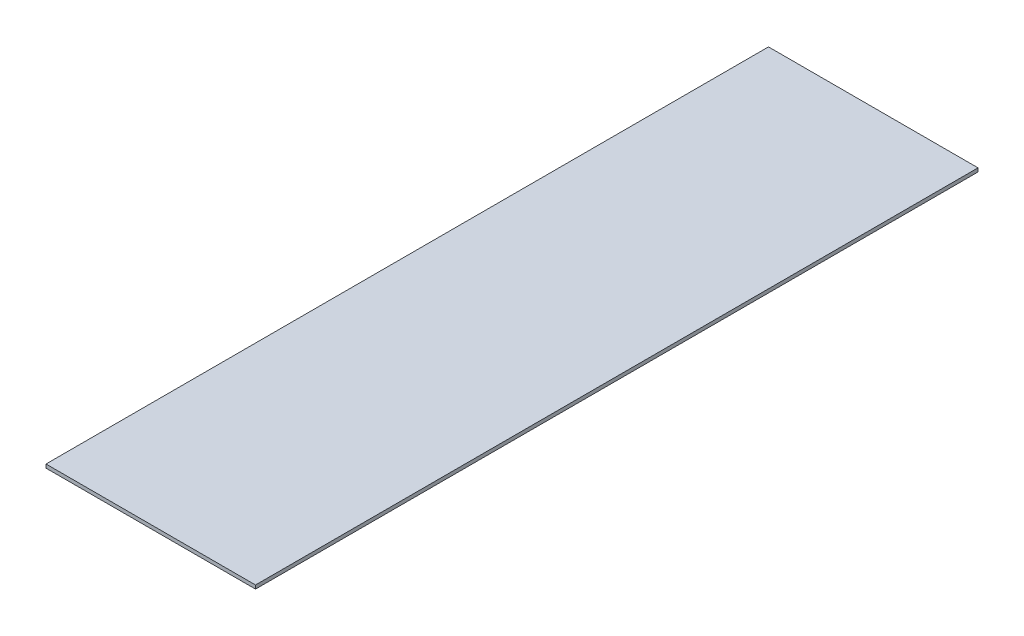
ISO-10303-21;
HEADER;
FILE_DESCRIPTION(('STEP AP214'),'2;1');
FILE_NAME('part.step','',(''),(''),'','','');
FILE_SCHEMA(('AUTOMOTIVE_DESIGN { 1 0 10303 214 1 1 1 1 }'));
ENDSEC;
DATA;
#1=APPLICATION_CONTEXT('core data for automotive mechanical design processes');
#2=APPLICATION_PROTOCOL_DEFINITION('international standard','automotive_design',2000,#1);
#3=PRODUCT_CONTEXT('',#1,'mechanical');
#4=PRODUCT('Part','Part','',(#3));
#5=PRODUCT_RELATED_PRODUCT_CATEGORY('part','',(#4));
#6=PRODUCT_DEFINITION_FORMATION('','',#4);
#7=PRODUCT_DEFINITION_CONTEXT('part definition',#1,'design');
#8=PRODUCT_DEFINITION('design','',#6,#7);
#9=PRODUCT_DEFINITION_SHAPE('','',#8);
#10=(LENGTH_UNIT() NAMED_UNIT(*) SI_UNIT(.MILLI.,.METRE.));
#11=(NAMED_UNIT(*) PLANE_ANGLE_UNIT() SI_UNIT($,.RADIAN.));
#12=(NAMED_UNIT(*) SI_UNIT($,.STERADIAN.) SOLID_ANGLE_UNIT());
#13=UNCERTAINTY_MEASURE_WITH_UNIT(LENGTH_MEASURE(1.E-05),#10,'distance_accuracy_value','');
#14=(GEOMETRIC_REPRESENTATION_CONTEXT(3) GLOBAL_UNCERTAINTY_ASSIGNED_CONTEXT((#13)) GLOBAL_UNIT_ASSIGNED_CONTEXT((#10,
#11,#12)) REPRESENTATION_CONTEXT('',''));
#15=CARTESIAN_POINT('',(0.,0.,0.));
#16=DIRECTION('',(0.,0.,1.));
#17=DIRECTION('',(1.,0.,0.));
#18=AXIS2_PLACEMENT_3D('',#15,#16,#17);
#19=CARTESIAN_POINT('',(0.,3.175,0.));
#20=DIRECTION('',(1.,0.,0.));
#21=DIRECTION('',(0.,0.,-1.));
#22=AXIS2_PLACEMENT_3D('',#19,#20,#21);
#23=PLANE('',#22);
#24=DIRECTION('',(0.,0.,1.));
#25=VECTOR('',#24,1.);
#26=CARTESIAN_POINT('',(0.,0.,0.));
#27=LINE('',#26,#25);
#28=CARTESIAN_POINT('',(0.,0.,-685.8));
#29=VERTEX_POINT('',#28);
#30=CARTESIAN_POINT('',(0.,0.,-50.8));
#31=VERTEX_POINT('',#30);
#32=EDGE_CURVE('E81',#29,#31,#27,.T.);
#33=ORIENTED_EDGE('',*,*,#32,.T.);
#34=DIRECTION('',(0.,1.,0.));
#35=VECTOR('',#34,1.);
#36=CARTESIAN_POINT('',(0.,0.,-50.8));
#37=LINE('',#36,#35);
#38=CARTESIAN_POINT('',(0.,3.175,-50.8));
#39=VERTEX_POINT('',#38);
#40=EDGE_CURVE('E47',#31,#39,#37,.T.);
#41=ORIENTED_EDGE('',*,*,#40,.T.);
#42=DIRECTION('',(0.,0.,1.));
#43=VECTOR('',#42,1.);
#44=CARTESIAN_POINT('',(0.,3.175,0.));
#45=LINE('',#44,#43);
#46=CARTESIAN_POINT('',(0.,3.175,-685.8));
#47=VERTEX_POINT('',#46);
#48=EDGE_CURVE('E76',#47,#39,#45,.T.);
#49=ORIENTED_EDGE('',*,*,#48,.F.);
#50=DIRECTION('',(0.,-1.,0.));
#51=VECTOR('',#50,1.);
#52=CARTESIAN_POINT('',(0.,3.175,-685.8));
#53=LINE('',#52,#51);
#54=EDGE_CURVE('E40',#47,#29,#53,.T.);
#55=ORIENTED_EDGE('',*,*,#54,.T.);
#56=EDGE_LOOP('',(#33,#41,#49,#55));
#57=FACE_BOUND('',#56,.T.);
#58=ADVANCED_FACE('F33',(#57),#23,.F.);
#59=CARTESIAN_POINT('',(184.15,3.175,0.));
#60=DIRECTION('',(-1.,0.,0.));
#61=DIRECTION('',(0.,0.,1.));
#62=AXIS2_PLACEMENT_3D('',#59,#60,#61);
#63=PLANE('',#62);
#64=DIRECTION('',(0.,0.,-1.));
#65=VECTOR('',#64,1.);
#66=CARTESIAN_POINT('',(184.15,3.175,0.));
#67=LINE('',#66,#65);
#68=CARTESIAN_POINT('',(184.15,3.175,-50.8));
#69=VERTEX_POINT('',#68);
#70=CARTESIAN_POINT('',(184.15,3.175,-685.8));
#71=VERTEX_POINT('',#70);
#72=EDGE_CURVE('E90',#69,#71,#67,.T.);
#73=ORIENTED_EDGE('',*,*,#72,.F.);
#74=DIRECTION('',(0.,1.,0.));
#75=VECTOR('',#74,1.);
#76=CARTESIAN_POINT('',(184.15,0.,-50.8));
#77=LINE('',#76,#75);
#78=CARTESIAN_POINT('',(184.15,0.,-50.8));
#79=VERTEX_POINT('',#78);
#80=EDGE_CURVE('E86',#79,#69,#77,.T.);
#81=ORIENTED_EDGE('',*,*,#80,.F.);
#82=DIRECTION('',(0.,0.,-1.));
#83=VECTOR('',#82,1.);
#84=CARTESIAN_POINT('',(184.15,0.,0.));
#85=LINE('',#84,#83);
#86=CARTESIAN_POINT('',(184.15,0.,-685.8));
#87=VERTEX_POINT('',#86);
#88=EDGE_CURVE('E77',#79,#87,#85,.T.);
#89=ORIENTED_EDGE('',*,*,#88,.T.);
#90=DIRECTION('',(0.,-1.,0.));
#91=VECTOR('',#90,1.);
#92=CARTESIAN_POINT('',(184.15,3.175,-685.8));
#93=LINE('',#92,#91);
#94=EDGE_CURVE('E11',#71,#87,#93,.T.);
#95=ORIENTED_EDGE('',*,*,#94,.F.);
#96=EDGE_LOOP('',(#73,#81,#89,#95));
#97=FACE_BOUND('',#96,.T.);
#98=ADVANCED_FACE('F111',(#97),#63,.F.);
#99=CARTESIAN_POINT('',(0.,3.175,-685.8));
#100=DIRECTION('',(0.,0.,1.));
#101=DIRECTION('',(1.,0.,0.));
#102=AXIS2_PLACEMENT_3D('',#99,#100,#101);
#103=PLANE('',#102);
#104=DIRECTION('',(-1.,0.,0.));
#105=VECTOR('',#104,1.);
#106=CARTESIAN_POINT('',(0.,0.,-685.8));
#107=LINE('',#106,#105);
#108=EDGE_CURVE('E68',#87,#29,#107,.T.);
#109=ORIENTED_EDGE('',*,*,#108,.T.);
#110=ORIENTED_EDGE('',*,*,#54,.F.);
#111=DIRECTION('',(-1.,0.,0.));
#112=VECTOR('',#111,1.);
#113=CARTESIAN_POINT('',(0.,3.175,-685.8));
#114=LINE('',#113,#112);
#115=EDGE_CURVE('E56',#71,#47,#114,.T.);
#116=ORIENTED_EDGE('',*,*,#115,.F.);
#117=ORIENTED_EDGE('',*,*,#94,.T.);
#118=EDGE_LOOP('',(#109,#110,#116,#117));
#119=FACE_BOUND('',#118,.T.);
#120=ADVANCED_FACE('F70',(#119),#103,.F.);
#121=CARTESIAN_POINT('',(0.,3.175,0.));
#122=DIRECTION('',(0.,-1.,0.));
#123=DIRECTION('',(0.,0.,-1.));
#124=AXIS2_PLACEMENT_3D('',#121,#122,#123);
#125=PLANE('',#124);
#126=ORIENTED_EDGE('',*,*,#48,.T.);
#127=DIRECTION('',(-1.,0.,0.));
#128=VECTOR('',#127,1.);
#129=CARTESIAN_POINT('',(0.,3.175,-50.8));
#130=LINE('',#129,#128);
#131=EDGE_CURVE('E95',#69,#39,#130,.T.);
#132=ORIENTED_EDGE('',*,*,#131,.F.);
#133=ORIENTED_EDGE('',*,*,#72,.T.);
#134=ORIENTED_EDGE('',*,*,#115,.T.);
#135=EDGE_LOOP('',(#126,#132,#133,#134));
#136=FACE_BOUND('',#135,.T.);
#137=ADVANCED_FACE('F103',(#136),#125,.F.);
#138=CARTESIAN_POINT('',(0.,0.,0.));
#139=DIRECTION('',(0.,-1.,0.));
#140=DIRECTION('',(0.,0.,-1.));
#141=AXIS2_PLACEMENT_3D('',#138,#139,#140);
#142=PLANE('',#141);
#143=DIRECTION('',(-1.,0.,0.));
#144=VECTOR('',#143,1.);
#145=CARTESIAN_POINT('',(0.,0.,-50.8));
#146=LINE('',#145,#144);
#147=EDGE_CURVE('E83',#79,#31,#146,.T.);
#148=ORIENTED_EDGE('',*,*,#147,.T.);
#149=ORIENTED_EDGE('',*,*,#32,.F.);
#150=ORIENTED_EDGE('',*,*,#108,.F.);
#151=ORIENTED_EDGE('',*,*,#88,.F.);
#152=EDGE_LOOP('',(#148,#149,#150,#151));
#153=FACE_BOUND('',#152,.T.);
#154=ADVANCED_FACE('F82',(#153),#142,.T.);
#155=CARTESIAN_POINT('',(0.,0.,-50.8));
#156=DIRECTION('',(0.,0.,-1.));
#157=DIRECTION('',(-1.,0.,0.));
#158=AXIS2_PLACEMENT_3D('',#155,#156,#157);
#159=PLANE('',#158);
#160=ORIENTED_EDGE('',*,*,#131,.T.);
#161=ORIENTED_EDGE('',*,*,#40,.F.);
#162=ORIENTED_EDGE('',*,*,#147,.F.);
#163=ORIENTED_EDGE('',*,*,#80,.T.);
#164=EDGE_LOOP('',(#160,#161,#162,#163));
#165=FACE_BOUND('',#164,.T.);
#166=ADVANCED_FACE('F99',(#165),#159,.F.);
#167=CLOSED_SHELL('',(#58,#98,#120,#137,#154,#166));
#168=MANIFOLD_SOLID_BREP('B2',#167);
#169=ADVANCED_BREP_SHAPE_REPRESENTATION('',(#18,#168),#14);
#170=SHAPE_DEFINITION_REPRESENTATION(#9,#169);
ENDSEC;
END-ISO-10303-21;
